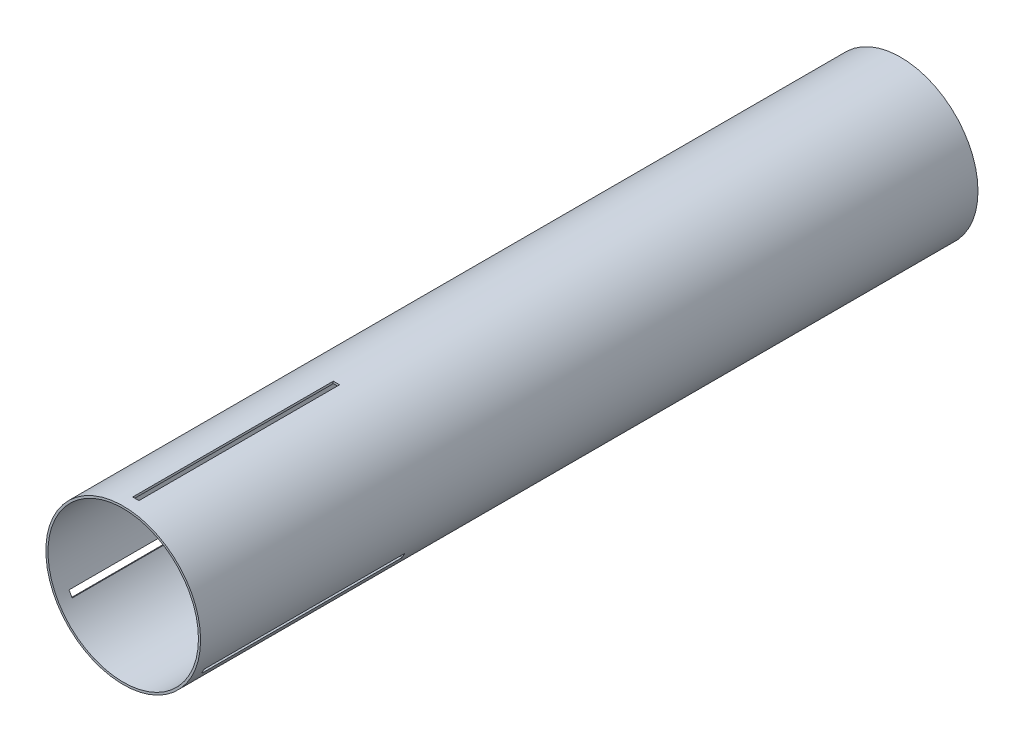
ISO-10303-21;
HEADER;
FILE_DESCRIPTION(('STEP AP214'),'2;1');
FILE_NAME('part.step','',(''),(''),'','','');
FILE_SCHEMA(('AUTOMOTIVE_DESIGN { 1 0 10303 214 1 1 1 1 }'));
ENDSEC;
DATA;
#1=APPLICATION_CONTEXT('core data for automotive mechanical design processes');
#2=APPLICATION_PROTOCOL_DEFINITION('international standard','automotive_design',2000,#1);
#3=PRODUCT_CONTEXT('',#1,'mechanical');
#4=PRODUCT('Part','Part','',(#3));
#5=PRODUCT_RELATED_PRODUCT_CATEGORY('part','',(#4));
#6=PRODUCT_DEFINITION_FORMATION('','',#4);
#7=PRODUCT_DEFINITION_CONTEXT('part definition',#1,'design');
#8=PRODUCT_DEFINITION('design','',#6,#7);
#9=PRODUCT_DEFINITION_SHAPE('','',#8);
#10=(LENGTH_UNIT() NAMED_UNIT(*) SI_UNIT(.MILLI.,.METRE.));
#11=(NAMED_UNIT(*) PLANE_ANGLE_UNIT() SI_UNIT($,.RADIAN.));
#12=(NAMED_UNIT(*) SI_UNIT($,.STERADIAN.) SOLID_ANGLE_UNIT());
#13=UNCERTAINTY_MEASURE_WITH_UNIT(LENGTH_MEASURE(1.E-05),#10,'distance_accuracy_value','');
#14=(GEOMETRIC_REPRESENTATION_CONTEXT(3) GLOBAL_UNCERTAINTY_ASSIGNED_CONTEXT((#13)) GLOBAL_UNIT_ASSIGNED_CONTEXT((#10,
#11,#12)) REPRESENTATION_CONTEXT('',''));
#15=CARTESIAN_POINT('',(0.,0.,0.));
#16=DIRECTION('',(0.,0.,1.));
#17=DIRECTION('',(1.,0.,0.));
#18=AXIS2_PLACEMENT_3D('',#15,#16,#17);
#19=CARTESIAN_POINT('',(0.,0.,787.4));
#20=DIRECTION('',(0.,0.,-1.));
#21=DIRECTION('',(-1.,0.,0.));
#22=AXIS2_PLACEMENT_3D('',#19,#20,#21);
#23=CYLINDRICAL_SURFACE('',#22,78.359);
#24=DIRECTION('',(0.,0.,-1.));
#25=VECTOR('',#24,1.);
#26=CARTESIAN_POINT('',(66.2176560871293,-41.8969557763647,787.4));
#27=LINE('',#26,#25);
#28=CARTESIAN_POINT('',(66.2176560871293,-41.8969557763647,571.5));
#29=VERTEX_POINT('',#28);
#30=CARTESIAN_POINT('',(66.2176560871293,-41.8969557763647,774.7));
#31=VERTEX_POINT('',#30);
#32=EDGE_CURVE('E157',#29,#31,#27,.F.);
#33=ORIENTED_EDGE('',*,*,#32,.T.);
#34=CARTESIAN_POINT('',(0.,0.,774.7));
#35=DIRECTION('',(0.,0.,1.));
#36=DIRECTION('',(1.,0.,0.));
#37=AXIS2_PLACEMENT_3D('',#34,#35,#36);
#38=CIRCLE('',#37,78.359);
#39=CARTESIAN_POINT('',(69.3926560871294,-36.3976944623336,774.7));
#40=VERTEX_POINT('',#39);
#41=EDGE_CURVE('E147',#31,#40,#38,.T.);
#42=ORIENTED_EDGE('',*,*,#41,.T.);
#43=DIRECTION('',(0.,0.,-1.));
#44=VECTOR('',#43,1.);
#45=CARTESIAN_POINT('',(69.3926560871294,-36.3976944623336,787.4));
#46=LINE('',#45,#44);
#47=CARTESIAN_POINT('',(69.3926560871294,-36.3976944623336,571.5));
#48=VERTEX_POINT('',#47);
#49=EDGE_CURVE('E155',#48,#40,#46,.F.);
#50=ORIENTED_EDGE('',*,*,#49,.F.);
#51=CARTESIAN_POINT('',(0.,0.,571.5));
#52=DIRECTION('',(0.,0.,1.));
#53=DIRECTION('',(1.,0.,0.));
#54=AXIS2_PLACEMENT_3D('',#51,#52,#53);
#55=CIRCLE('',#54,78.359);
#56=EDGE_CURVE('E148',#29,#48,#55,.T.);
#57=ORIENTED_EDGE('',*,*,#56,.F.);
#58=EDGE_LOOP('',(#33,#42,#50,#57));
#59=FACE_BOUND('',#58,.T.);
#60=DIRECTION('',(0.,0.,-1.));
#61=VECTOR('',#60,1.);
#62=CARTESIAN_POINT('',(-3.175,78.2946502386977,787.4));
#63=LINE('',#62,#61);
#64=CARTESIAN_POINT('',(-3.175,78.2946502386977,571.5));
#65=VERTEX_POINT('',#64);
#66=CARTESIAN_POINT('',(-3.175,78.2946502386977,774.7));
#67=VERTEX_POINT('',#66);
#68=EDGE_CURVE('E179',#65,#67,#63,.F.);
#69=ORIENTED_EDGE('',*,*,#68,.F.);
#70=CARTESIAN_POINT('',(0.,0.,571.5));
#71=DIRECTION('',(0.,0.,1.));
#72=DIRECTION('',(1.,0.,0.));
#73=AXIS2_PLACEMENT_3D('',#70,#71,#72);
#74=CIRCLE('',#73,78.359);
#75=CARTESIAN_POINT('',(3.175,78.2946502386977,571.5));
#76=VERTEX_POINT('',#75);
#77=EDGE_CURVE('E171',#76,#65,#74,.T.);
#78=ORIENTED_EDGE('',*,*,#77,.F.);
#79=DIRECTION('',(0.,0.,-1.));
#80=VECTOR('',#79,1.);
#81=CARTESIAN_POINT('',(3.175,78.2946502386977,787.4));
#82=LINE('',#81,#80);
#83=CARTESIAN_POINT('',(3.175,78.2946502386977,774.7));
#84=VERTEX_POINT('',#83);
#85=EDGE_CURVE('E173',#76,#84,#82,.F.);
#86=ORIENTED_EDGE('',*,*,#85,.T.);
#87=CARTESIAN_POINT('',(0.,0.,774.7));
#88=DIRECTION('',(0.,0.,1.));
#89=DIRECTION('',(1.,0.,0.));
#90=AXIS2_PLACEMENT_3D('',#87,#88,#89);
#91=CIRCLE('',#90,78.359);
#92=EDGE_CURVE('E176',#84,#67,#91,.T.);
#93=ORIENTED_EDGE('',*,*,#92,.T.);
#94=EDGE_LOOP('',(#69,#78,#86,#93));
#95=FACE_BOUND('',#94,.T.);
#96=CARTESIAN_POINT('',(0.,0.,787.4));
#97=DIRECTION('',(0.,0.,1.));
#98=DIRECTION('',(1.,0.,0.));
#99=AXIS2_PLACEMENT_3D('',#96,#97,#98);
#100=CIRCLE('',#99,78.359);
#101=CARTESIAN_POINT('',(78.359,0.,787.4));
#102=VERTEX_POINT('',#101);
#103=EDGE_CURVE('E188',#102,#102,#100,.T.);
#104=ORIENTED_EDGE('',*,*,#103,.F.);
#105=EDGE_LOOP('',(#104));
#106=FACE_BOUND('',#105,.T.);
#107=CARTESIAN_POINT('',(0.,0.,0.));
#108=DIRECTION('',(0.,0.,1.));
#109=DIRECTION('',(1.,0.,0.));
#110=AXIS2_PLACEMENT_3D('',#107,#108,#109);
#111=CIRCLE('',#110,78.359);
#112=CARTESIAN_POINT('',(78.359,0.,0.));
#113=VERTEX_POINT('',#112);
#114=EDGE_CURVE('E185',#113,#113,#111,.T.);
#115=ORIENTED_EDGE('',*,*,#114,.T.);
#116=EDGE_LOOP('',(#115));
#117=FACE_BOUND('',#116,.T.);
#118=DIRECTION('',(0.,0.,-1.));
#119=VECTOR('',#118,1.);
#120=CARTESIAN_POINT('',(-66.2176560871299,-41.8969557763638,787.4));
#121=LINE('',#120,#119);
#122=CARTESIAN_POINT('',(-66.2176560871299,-41.8969557763638,571.5));
#123=VERTEX_POINT('',#122);
#124=CARTESIAN_POINT('',(-66.2176560871299,-41.8969557763638,774.7));
#125=VERTEX_POINT('',#124);
#126=EDGE_CURVE('E133',#123,#125,#121,.F.);
#127=ORIENTED_EDGE('',*,*,#126,.F.);
#128=CARTESIAN_POINT('',(-69.3926560871299,-36.3976944623326,571.5));
#129=VERTEX_POINT('',#128);
#130=EDGE_CURVE('E139',#129,#123,#55,.T.);
#131=ORIENTED_EDGE('',*,*,#130,.F.);
#132=DIRECTION('',(0.,0.,-1.));
#133=VECTOR('',#132,1.);
#134=CARTESIAN_POINT('',(-69.3926560871299,-36.3976944623326,787.4));
#135=LINE('',#134,#133);
#136=CARTESIAN_POINT('',(-69.3926560871299,-36.3976944623326,774.7));
#137=VERTEX_POINT('',#136);
#138=EDGE_CURVE('E125',#129,#137,#135,.F.);
#139=ORIENTED_EDGE('',*,*,#138,.T.);
#140=EDGE_CURVE('E151',#137,#125,#38,.T.);
#141=ORIENTED_EDGE('',*,*,#140,.T.);
#142=EDGE_LOOP('',(#127,#131,#139,#141));
#143=FACE_BOUND('',#142,.T.);
#144=ADVANCED_FACE('F38',(#59,#95,#106,#117,#143),#23,.T.);
#145=CARTESIAN_POINT('',(0.,0.,787.4));
#146=DIRECTION('',(0.,0.,-1.));
#147=DIRECTION('',(-1.,0.,0.));
#148=AXIS2_PLACEMENT_3D('',#145,#146,#147);
#149=CYLINDRICAL_SURFACE('',#148,76.2);
#150=CARTESIAN_POINT('',(0.,0.,774.7));
#151=DIRECTION('',(0.,0.,1.));
#152=DIRECTION('',(1.,0.,0.));
#153=AXIS2_PLACEMENT_3D('',#150,#151,#152);
#154=CIRCLE('',#153,76.2);
#155=CARTESIAN_POINT('',(64.346326911912,-40.8165433733106,774.7));
#156=VERTEX_POINT('',#155);
#157=CARTESIAN_POINT('',(67.521326911912,-35.3172820592794,774.7));
#158=VERTEX_POINT('',#157);
#159=EDGE_CURVE('E11',#156,#158,#154,.T.);
#160=ORIENTED_EDGE('',*,*,#159,.F.);
#161=DIRECTION('',(0.,0.,-1.));
#162=VECTOR('',#161,1.);
#163=CARTESIAN_POINT('',(64.346326911912,-40.8165433733106,787.4));
#164=LINE('',#163,#162);
#165=CARTESIAN_POINT('',(64.346326911912,-40.8165433733106,571.5));
#166=VERTEX_POINT('',#165);
#167=EDGE_CURVE('E41',#166,#156,#164,.F.);
#168=ORIENTED_EDGE('',*,*,#167,.F.);
#169=CARTESIAN_POINT('',(0.,0.,571.5));
#170=DIRECTION('',(0.,0.,1.));
#171=DIRECTION('',(1.,0.,0.));
#172=AXIS2_PLACEMENT_3D('',#169,#170,#171);
#173=CIRCLE('',#172,76.2);
#174=CARTESIAN_POINT('',(67.521326911912,-35.3172820592794,571.5));
#175=VERTEX_POINT('',#174);
#176=EDGE_CURVE('E205',#166,#175,#173,.T.);
#177=ORIENTED_EDGE('',*,*,#176,.T.);
#178=DIRECTION('',(0.,0.,-1.));
#179=VECTOR('',#178,1.);
#180=CARTESIAN_POINT('',(67.521326911912,-35.3172820592794,787.4));
#181=LINE('',#180,#179);
#182=EDGE_CURVE('E209',#175,#158,#181,.F.);
#183=ORIENTED_EDGE('',*,*,#182,.T.);
#184=EDGE_LOOP('',(#160,#168,#177,#183));
#185=FACE_BOUND('',#184,.T.);
#186=CARTESIAN_POINT('',(0.,0.,787.4));
#187=DIRECTION('',(0.,0.,1.));
#188=DIRECTION('',(1.,0.,0.));
#189=AXIS2_PLACEMENT_3D('',#186,#187,#188);
#190=CIRCLE('',#189,76.2);
#191=CARTESIAN_POINT('',(76.2,0.,787.4));
#192=VERTEX_POINT('',#191);
#193=EDGE_CURVE('E182',#192,#192,#190,.T.);
#194=ORIENTED_EDGE('',*,*,#193,.T.);
#195=EDGE_LOOP('',(#194));
#196=FACE_BOUND('',#195,.T.);
#197=CARTESIAN_POINT('',(0.,0.,0.));
#198=DIRECTION('',(0.,0.,1.));
#199=DIRECTION('',(1.,0.,0.));
#200=AXIS2_PLACEMENT_3D('',#197,#198,#199);
#201=CIRCLE('',#200,76.2);
#202=CARTESIAN_POINT('',(76.2,0.,0.));
#203=VERTEX_POINT('',#202);
#204=EDGE_CURVE('E181',#203,#203,#201,.T.);
#205=ORIENTED_EDGE('',*,*,#204,.F.);
#206=EDGE_LOOP('',(#205));
#207=FACE_BOUND('',#206,.T.);
#208=CARTESIAN_POINT('',(0.,0.,571.5));
#209=DIRECTION('',(0.,0.,1.));
#210=DIRECTION('',(1.,0.,0.));
#211=AXIS2_PLACEMENT_3D('',#208,#209,#210);
#212=CIRCLE('',#211,76.2);
#213=CARTESIAN_POINT('',(3.175,76.1338254325894,571.5));
#214=VERTEX_POINT('',#213);
#215=CARTESIAN_POINT('',(-3.175,76.1338254325894,571.5));
#216=VERTEX_POINT('',#215);
#217=EDGE_CURVE('E191',#214,#216,#212,.T.);
#218=ORIENTED_EDGE('',*,*,#217,.T.);
#219=DIRECTION('',(0.,0.,-1.));
#220=VECTOR('',#219,1.);
#221=CARTESIAN_POINT('',(-3.175,76.1338254325894,787.4));
#222=LINE('',#221,#220);
#223=CARTESIAN_POINT('',(-3.175,76.1338254325894,774.7));
#224=VERTEX_POINT('',#223);
#225=EDGE_CURVE('E200',#216,#224,#222,.F.);
#226=ORIENTED_EDGE('',*,*,#225,.T.);
#227=CARTESIAN_POINT('',(0.,0.,774.7));
#228=DIRECTION('',(0.,0.,1.));
#229=DIRECTION('',(1.,0.,0.));
#230=AXIS2_PLACEMENT_3D('',#227,#228,#229);
#231=CIRCLE('',#230,76.2);
#232=CARTESIAN_POINT('',(3.175,76.1338254325894,774.7));
#233=VERTEX_POINT('',#232);
#234=EDGE_CURVE('E198',#233,#224,#231,.T.);
#235=ORIENTED_EDGE('',*,*,#234,.F.);
#236=DIRECTION('',(0.,0.,-1.));
#237=VECTOR('',#236,1.);
#238=CARTESIAN_POINT('',(3.175,76.1338254325894,787.4));
#239=LINE('',#238,#237);
#240=EDGE_CURVE('E196',#214,#233,#239,.F.);
#241=ORIENTED_EDGE('',*,*,#240,.F.);
#242=EDGE_LOOP('',(#218,#226,#235,#241));
#243=FACE_BOUND('',#242,.T.);
#244=CARTESIAN_POINT('',(-67.5213269119126,-35.3172820592785,571.5));
#245=VERTEX_POINT('',#244);
#246=CARTESIAN_POINT('',(-64.3463269119126,-40.8165433733097,571.5));
#247=VERTEX_POINT('',#246);
#248=EDGE_CURVE('E142',#245,#247,#173,.T.);
#249=ORIENTED_EDGE('',*,*,#248,.T.);
#250=DIRECTION('',(0.,0.,-1.));
#251=VECTOR('',#250,1.);
#252=CARTESIAN_POINT('',(-64.3463269119126,-40.8165433733097,787.4));
#253=LINE('',#252,#251);
#254=CARTESIAN_POINT('',(-64.3463269119126,-40.8165433733097,774.7));
#255=VERTEX_POINT('',#254);
#256=EDGE_CURVE('E207',#247,#255,#253,.F.);
#257=ORIENTED_EDGE('',*,*,#256,.T.);
#258=CARTESIAN_POINT('',(-67.5213269119126,-35.3172820592785,774.7));
#259=VERTEX_POINT('',#258);
#260=EDGE_CURVE('E47',#259,#255,#154,.T.);
#261=ORIENTED_EDGE('',*,*,#260,.F.);
#262=DIRECTION('',(0.,0.,-1.));
#263=VECTOR('',#262,1.);
#264=CARTESIAN_POINT('',(-67.5213269119126,-35.3172820592785,787.4));
#265=LINE('',#264,#263);
#266=EDGE_CURVE('E203',#245,#259,#265,.F.);
#267=ORIENTED_EDGE('',*,*,#266,.F.);
#268=EDGE_LOOP('',(#249,#257,#261,#267));
#269=FACE_BOUND('',#268,.T.);
#270=ADVANCED_FACE('F216',(#185,#196,#207,#243,#269),#149,.F.);
#271=CARTESIAN_POINT('',(0.,0.,787.4));
#272=DIRECTION('',(0.,0.,1.));
#273=DIRECTION('',(1.,0.,0.));
#274=AXIS2_PLACEMENT_3D('',#271,#272,#273);
#275=PLANE('',#274);
#276=ORIENTED_EDGE('',*,*,#103,.T.);
#277=EDGE_LOOP('',(#276));
#278=FACE_BOUND('',#277,.T.);
#279=ORIENTED_EDGE('',*,*,#193,.F.);
#280=EDGE_LOOP('',(#279));
#281=FACE_BOUND('',#280,.T.);
#282=ADVANCED_FACE('F254',(#278,#281),#275,.T.);
#283=CARTESIAN_POINT('',(0.,0.,0.));
#284=DIRECTION('',(0.,0.,1.));
#285=DIRECTION('',(1.,0.,0.));
#286=AXIS2_PLACEMENT_3D('',#283,#284,#285);
#287=PLANE('',#286);
#288=ORIENTED_EDGE('',*,*,#114,.F.);
#289=EDGE_LOOP('',(#288));
#290=FACE_BOUND('',#289,.T.);
#291=ORIENTED_EDGE('',*,*,#204,.T.);
#292=EDGE_LOOP('',(#291));
#293=FACE_BOUND('',#292,.T.);
#294=ADVANCED_FACE('F250',(#290,#293),#287,.F.);
#295=CARTESIAN_POINT('',(-3.175,153.416,571.5));
#296=DIRECTION('',(1.,0.,0.));
#297=DIRECTION('',(0.,0.,-1.));
#298=AXIS2_PLACEMENT_3D('',#295,#296,#297);
#299=PLANE('',#298);
#300=ORIENTED_EDGE('',*,*,#68,.T.);
#301=DIRECTION('',(0.,-1.,0.));
#302=VECTOR('',#301,1.);
#303=CARTESIAN_POINT('',(-3.175,153.416,774.7));
#304=LINE('',#303,#302);
#305=EDGE_CURVE('E168',#67,#224,#304,.T.);
#306=ORIENTED_EDGE('',*,*,#305,.T.);
#307=ORIENTED_EDGE('',*,*,#225,.F.);
#308=DIRECTION('',(0.,-1.,0.));
#309=VECTOR('',#308,1.);
#310=CARTESIAN_POINT('',(-3.175,153.416,571.5));
#311=LINE('',#310,#309);
#312=EDGE_CURVE('E160',#65,#216,#311,.T.);
#313=ORIENTED_EDGE('',*,*,#312,.F.);
#314=EDGE_LOOP('',(#300,#306,#307,#313));
#315=FACE_BOUND('',#314,.T.);
#316=ADVANCED_FACE('F253',(#315),#299,.T.);
#317=CARTESIAN_POINT('',(3.175,153.416,774.7));
#318=DIRECTION('',(0.,0.,1.));
#319=DIRECTION('',(1.,0.,0.));
#320=AXIS2_PLACEMENT_3D('',#317,#318,#319);
#321=PLANE('',#320);
#322=DIRECTION('',(0.,-1.,0.));
#323=VECTOR('',#322,1.);
#324=CARTESIAN_POINT('',(3.175,153.416,774.7));
#325=LINE('',#324,#323);
#326=EDGE_CURVE('E165',#84,#233,#325,.T.);
#327=ORIENTED_EDGE('',*,*,#326,.T.);
#328=ORIENTED_EDGE('',*,*,#234,.T.);
#329=ORIENTED_EDGE('',*,*,#305,.F.);
#330=ORIENTED_EDGE('',*,*,#92,.F.);
#331=EDGE_LOOP('',(#327,#328,#329,#330));
#332=FACE_BOUND('',#331,.T.);
#333=ADVANCED_FACE('F293',(#332),#321,.F.);
#334=CARTESIAN_POINT('',(3.175,153.416,571.5));
#335=DIRECTION('',(1.,0.,0.));
#336=DIRECTION('',(0.,0.,-1.));
#337=AXIS2_PLACEMENT_3D('',#334,#335,#336);
#338=PLANE('',#337);
#339=DIRECTION('',(0.,-1.,0.));
#340=VECTOR('',#339,1.);
#341=CARTESIAN_POINT('',(3.175,153.416,571.5));
#342=LINE('',#341,#340);
#343=EDGE_CURVE('E162',#76,#214,#342,.T.);
#344=ORIENTED_EDGE('',*,*,#343,.T.);
#345=ORIENTED_EDGE('',*,*,#240,.T.);
#346=ORIENTED_EDGE('',*,*,#326,.F.);
#347=ORIENTED_EDGE('',*,*,#85,.F.);
#348=EDGE_LOOP('',(#344,#345,#346,#347));
#349=FACE_BOUND('',#348,.T.);
#350=ADVANCED_FACE('F279',(#349),#338,.F.);
#351=CARTESIAN_POINT('',(3.175,153.416,571.5));
#352=DIRECTION('',(0.,0.,1.));
#353=DIRECTION('',(1.,0.,0.));
#354=AXIS2_PLACEMENT_3D('',#351,#352,#353);
#355=PLANE('',#354);
#356=ORIENTED_EDGE('',*,*,#77,.T.);
#357=ORIENTED_EDGE('',*,*,#312,.T.);
#358=ORIENTED_EDGE('',*,*,#217,.F.);
#359=ORIENTED_EDGE('',*,*,#343,.F.);
#360=EDGE_LOOP('',(#356,#357,#358,#359));
#361=FACE_BOUND('',#360,.T.);
#362=ADVANCED_FACE('F272',(#361),#355,.T.);
#363=CARTESIAN_POINT('',(-131.274653346994,-79.4576306570144,571.5));
#364=DIRECTION('',(-0.499999999999992,0.866025403784443,0.));
#365=DIRECTION('',(-0.866025403784443,-0.499999999999992,0.));
#366=AXIS2_PLACEMENT_3D('',#363,#364,#365);
#367=PLANE('',#366);
#368=ORIENTED_EDGE('',*,*,#126,.T.);
#369=DIRECTION('',(0.866025403784443,0.499999999999992,0.));
#370=VECTOR('',#369,1.);
#371=CARTESIAN_POINT('',(-131.274653346994,-79.4576306570144,774.7));
#372=LINE('',#371,#370);
#373=EDGE_CURVE('E229',#125,#255,#372,.T.);
#374=ORIENTED_EDGE('',*,*,#373,.T.);
#375=ORIENTED_EDGE('',*,*,#256,.F.);
#376=DIRECTION('',(0.866025403784443,0.499999999999992,0.));
#377=VECTOR('',#376,1.);
#378=CARTESIAN_POINT('',(-131.274653346994,-79.4576306570144,571.5));
#379=LINE('',#378,#377);
#380=EDGE_CURVE('E144',#123,#247,#379,.T.);
#381=ORIENTED_EDGE('',*,*,#380,.F.);
#382=EDGE_LOOP('',(#368,#374,#375,#381));
#383=FACE_BOUND('',#382,.T.);
#384=ADVANCED_FACE('F270',(#383),#367,.T.);
#385=CARTESIAN_POINT('',(-134.449653346994,-73.9583693429832,571.5));
#386=DIRECTION('',(-0.499999999999992,0.866025403784443,0.));
#387=DIRECTION('',(-0.866025403784443,-0.499999999999992,0.));
#388=AXIS2_PLACEMENT_3D('',#385,#386,#387);
#389=PLANE('',#388);
#390=DIRECTION('',(0.866025403784443,0.499999999999992,0.));
#391=VECTOR('',#390,1.);
#392=CARTESIAN_POINT('',(-134.449653346994,-73.9583693429832,571.5));
#393=LINE('',#392,#391);
#394=EDGE_CURVE('E128',#129,#245,#393,.T.);
#395=ORIENTED_EDGE('',*,*,#394,.T.);
#396=ORIENTED_EDGE('',*,*,#266,.T.);
#397=DIRECTION('',(0.866025403784443,0.499999999999992,0.));
#398=VECTOR('',#397,1.);
#399=CARTESIAN_POINT('',(-134.449653346994,-73.9583693429832,774.7));
#400=LINE('',#399,#398);
#401=EDGE_CURVE('E62',#137,#259,#400,.T.);
#402=ORIENTED_EDGE('',*,*,#401,.F.);
#403=ORIENTED_EDGE('',*,*,#138,.F.);
#404=EDGE_LOOP('',(#395,#396,#402,#403));
#405=FACE_BOUND('',#404,.T.);
#406=ADVANCED_FACE('F127',(#405),#389,.F.);
#407=CARTESIAN_POINT('',(131.274653346993,-79.4576306570162,571.5));
#408=DIRECTION('',(0.,0.,1.));
#409=DIRECTION('',(1.,0.,0.));
#410=AXIS2_PLACEMENT_3D('',#407,#408,#409);
#411=PLANE('',#410);
#412=ORIENTED_EDGE('',*,*,#130,.T.);
#413=ORIENTED_EDGE('',*,*,#380,.T.);
#414=ORIENTED_EDGE('',*,*,#248,.F.);
#415=ORIENTED_EDGE('',*,*,#394,.F.);
#416=EDGE_LOOP('',(#412,#413,#414,#415));
#417=FACE_BOUND('',#416,.T.);
#418=ADVANCED_FACE('F137',(#417),#411,.T.);
#419=CARTESIAN_POINT('',(131.274653346993,-79.4576306570162,774.7));
#420=DIRECTION('',(0.,0.,1.));
#421=DIRECTION('',(1.,0.,0.));
#422=AXIS2_PLACEMENT_3D('',#419,#420,#421);
#423=PLANE('',#422);
#424=ORIENTED_EDGE('',*,*,#401,.T.);
#425=ORIENTED_EDGE('',*,*,#260,.T.);
#426=ORIENTED_EDGE('',*,*,#373,.F.);
#427=ORIENTED_EDGE('',*,*,#140,.F.);
#428=EDGE_LOOP('',(#424,#425,#426,#427));
#429=FACE_BOUND('',#428,.T.);
#430=ADVANCED_FACE('F264',(#429),#423,.F.);
#431=CARTESIAN_POINT('',(131.274653346993,-79.4576306570162,571.5));
#432=DIRECTION('',(-0.500000000000004,-0.866025403784436,0.));
#433=DIRECTION('',(0.866025403784436,-0.500000000000004,0.));
#434=AXIS2_PLACEMENT_3D('',#431,#432,#433);
#435=PLANE('',#434);
#436=DIRECTION('',(-0.866025403784436,0.500000000000004,0.));
#437=VECTOR('',#436,1.);
#438=CARTESIAN_POINT('',(131.274653346993,-79.4576306570162,571.5));
#439=LINE('',#438,#437);
#440=EDGE_CURVE('E54',#29,#166,#439,.T.);
#441=ORIENTED_EDGE('',*,*,#440,.T.);
#442=ORIENTED_EDGE('',*,*,#167,.T.);
#443=DIRECTION('',(-0.866025403784436,0.500000000000004,0.));
#444=VECTOR('',#443,1.);
#445=CARTESIAN_POINT('',(131.274653346993,-79.4576306570162,774.7));
#446=LINE('',#445,#444);
#447=EDGE_CURVE('E226',#31,#156,#446,.T.);
#448=ORIENTED_EDGE('',*,*,#447,.F.);
#449=ORIENTED_EDGE('',*,*,#32,.F.);
#450=EDGE_LOOP('',(#441,#442,#448,#449));
#451=FACE_BOUND('',#450,.T.);
#452=ADVANCED_FACE('F222',(#451),#435,.F.);
#453=CARTESIAN_POINT('',(134.449653346993,-73.958369342985,571.5));
#454=DIRECTION('',(-0.500000000000004,-0.866025403784436,0.));
#455=DIRECTION('',(0.866025403784436,-0.500000000000004,0.));
#456=AXIS2_PLACEMENT_3D('',#453,#454,#455);
#457=PLANE('',#456);
#458=ORIENTED_EDGE('',*,*,#49,.T.);
#459=DIRECTION('',(-0.866025403784436,0.500000000000004,0.));
#460=VECTOR('',#459,1.);
#461=CARTESIAN_POINT('',(134.449653346993,-73.958369342985,774.7));
#462=LINE('',#461,#460);
#463=EDGE_CURVE('E134',#40,#158,#462,.T.);
#464=ORIENTED_EDGE('',*,*,#463,.T.);
#465=ORIENTED_EDGE('',*,*,#182,.F.);
#466=DIRECTION('',(-0.866025403784436,0.500000000000004,0.));
#467=VECTOR('',#466,1.);
#468=CARTESIAN_POINT('',(134.449653346993,-73.958369342985,571.5));
#469=LINE('',#468,#467);
#470=EDGE_CURVE('E220',#48,#175,#469,.T.);
#471=ORIENTED_EDGE('',*,*,#470,.F.);
#472=EDGE_LOOP('',(#458,#464,#465,#471));
#473=FACE_BOUND('',#472,.T.);
#474=ADVANCED_FACE('F236',(#473),#457,.T.);
#475=ORIENTED_EDGE('',*,*,#447,.T.);
#476=ORIENTED_EDGE('',*,*,#159,.T.);
#477=ORIENTED_EDGE('',*,*,#463,.F.);
#478=ORIENTED_EDGE('',*,*,#41,.F.);
#479=EDGE_LOOP('',(#475,#476,#477,#478));
#480=FACE_BOUND('',#479,.T.);
#481=ADVANCED_FACE('F239',(#480),#423,.F.);
#482=ORIENTED_EDGE('',*,*,#56,.T.);
#483=ORIENTED_EDGE('',*,*,#470,.T.);
#484=ORIENTED_EDGE('',*,*,#176,.F.);
#485=ORIENTED_EDGE('',*,*,#440,.F.);
#486=EDGE_LOOP('',(#482,#483,#484,#485));
#487=FACE_BOUND('',#486,.T.);
#488=ADVANCED_FACE('F218',(#487),#411,.T.);
#489=CLOSED_SHELL('',(#144,#270,#282,#294,#316,#333,#350,#362,#384,#406,#418,#430,#452,#474,
#481,#488));
#490=MANIFOLD_SOLID_BREP('B2',#489);
#491=ADVANCED_BREP_SHAPE_REPRESENTATION('',(#18,#490),#14);
#492=SHAPE_DEFINITION_REPRESENTATION(#9,#491);
ENDSEC;
END-ISO-10303-21;
